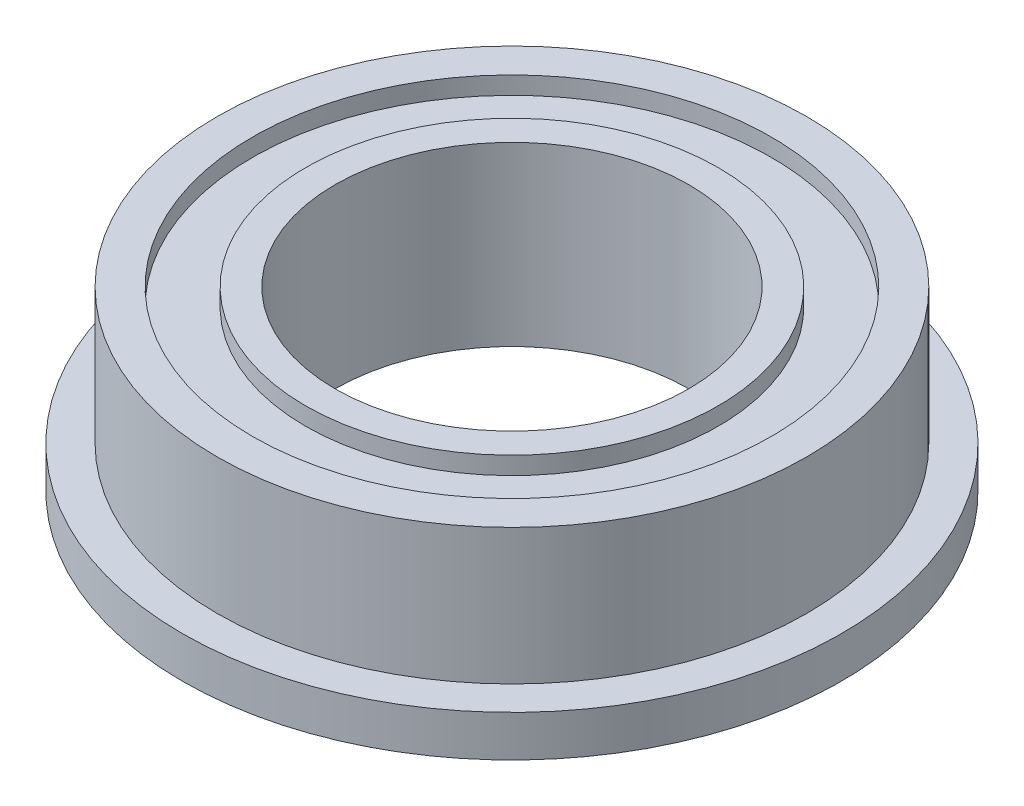
ISO-10303-21;
HEADER;
FILE_DESCRIPTION(('STEP AP214'),'2;1');
FILE_NAME('part.step','',(''),(''),'','','');
FILE_SCHEMA(('AUTOMOTIVE_DESIGN { 1 0 10303 214 1 1 1 1 }'));
ENDSEC;
DATA;
#1=APPLICATION_CONTEXT('core data for automotive mechanical design processes');
#2=APPLICATION_PROTOCOL_DEFINITION('international standard','automotive_design',2000,#1);
#3=PRODUCT_CONTEXT('',#1,'mechanical');
#4=PRODUCT('Part','Part','',(#3));
#5=PRODUCT_RELATED_PRODUCT_CATEGORY('part','',(#4));
#6=PRODUCT_DEFINITION_FORMATION('','',#4);
#7=PRODUCT_DEFINITION_CONTEXT('part definition',#1,'design');
#8=PRODUCT_DEFINITION('design','',#6,#7);
#9=PRODUCT_DEFINITION_SHAPE('','',#8);
#10=(LENGTH_UNIT() NAMED_UNIT(*) SI_UNIT(.MILLI.,.METRE.));
#11=(NAMED_UNIT(*) PLANE_ANGLE_UNIT() SI_UNIT($,.RADIAN.));
#12=(NAMED_UNIT(*) SI_UNIT($,.STERADIAN.) SOLID_ANGLE_UNIT());
#13=UNCERTAINTY_MEASURE_WITH_UNIT(LENGTH_MEASURE(1.E-05),#10,'distance_accuracy_value','');
#14=(GEOMETRIC_REPRESENTATION_CONTEXT(3) GLOBAL_UNCERTAINTY_ASSIGNED_CONTEXT((#13)) GLOBAL_UNIT_ASSIGNED_CONTEXT((#10,
#11,#12)) REPRESENTATION_CONTEXT('',''));
#15=CARTESIAN_POINT('',(0.,0.,0.));
#16=DIRECTION('',(0.,0.,1.));
#17=DIRECTION('',(1.,0.,0.));
#18=AXIS2_PLACEMENT_3D('',#15,#16,#17);
#19=CARTESIAN_POINT('',(0.,0.,0.));
#20=DIRECTION('',(0.,1.,0.));
#21=DIRECTION('',(0.,0.,1.));
#22=AXIS2_PLACEMENT_3D('',#19,#20,#21);
#23=PLANE('',#22);
#24=CARTESIAN_POINT('',(0.,0.,0.));
#25=DIRECTION('',(0.,1.,0.));
#26=DIRECTION('',(0.,0.,1.));
#27=AXIS2_PLACEMENT_3D('',#24,#25,#26);
#28=CIRCLE('',#27,3.);
#29=CARTESIAN_POINT('',(0.,0.,3.));
#30=VERTEX_POINT('',#29);
#31=EDGE_CURVE('E43',#30,#30,#28,.T.);
#32=ORIENTED_EDGE('',*,*,#31,.T.);
#33=EDGE_LOOP('',(#32));
#34=FACE_BOUND('',#33,.T.);
#35=CARTESIAN_POINT('',(0.,0.,0.));
#36=DIRECTION('',(0.,1.,0.));
#37=DIRECTION('',(0.,0.,1.));
#38=AXIS2_PLACEMENT_3D('',#35,#36,#37);
#39=CIRCLE('',#38,3.5);
#40=CARTESIAN_POINT('',(0.,0.,3.5));
#41=VERTEX_POINT('',#40);
#42=EDGE_CURVE('E77',#41,#41,#39,.T.);
#43=ORIENTED_EDGE('',*,*,#42,.F.);
#44=EDGE_LOOP('',(#43));
#45=FACE_BOUND('',#44,.T.);
#46=ADVANCED_FACE('F32',(#34,#45),#23,.F.);
#47=CARTESIAN_POINT('',(0.,3.,0.));
#48=DIRECTION('',(0.,1.,0.));
#49=DIRECTION('',(0.,0.,1.));
#50=AXIS2_PLACEMENT_3D('',#47,#48,#49);
#51=PLANE('',#50);
#52=CARTESIAN_POINT('',(0.,3.,0.));
#53=DIRECTION('',(0.,1.,0.));
#54=DIRECTION('',(0.,0.,1.));
#55=AXIS2_PLACEMENT_3D('',#52,#53,#54);
#56=CIRCLE('',#55,3.);
#57=CARTESIAN_POINT('',(0.,3.,3.));
#58=VERTEX_POINT('',#57);
#59=EDGE_CURVE('E39',#58,#58,#56,.T.);
#60=ORIENTED_EDGE('',*,*,#59,.F.);
#61=EDGE_LOOP('',(#60));
#62=FACE_BOUND('',#61,.T.);
#63=CARTESIAN_POINT('',(0.,3.,0.));
#64=DIRECTION('',(0.,1.,0.));
#65=DIRECTION('',(0.,0.,1.));
#66=AXIS2_PLACEMENT_3D('',#63,#64,#65);
#67=CIRCLE('',#66,3.5);
#68=CARTESIAN_POINT('',(0.,3.,3.5));
#69=VERTEX_POINT('',#68);
#70=EDGE_CURVE('E65',#69,#69,#67,.T.);
#71=ORIENTED_EDGE('',*,*,#70,.T.);
#72=EDGE_LOOP('',(#71));
#73=FACE_BOUND('',#72,.T.);
#74=ADVANCED_FACE('F93',(#62,#73),#51,.T.);
#75=CARTESIAN_POINT('',(0.,3.,0.));
#76=DIRECTION('',(0.,1.,0.));
#77=DIRECTION('',(0.,0.,1.));
#78=AXIS2_PLACEMENT_3D('',#75,#76,#77);
#79=CIRCLE('',#78,4.4);
#80=CARTESIAN_POINT('',(0.,3.,4.4));
#81=VERTEX_POINT('',#80);
#82=EDGE_CURVE('E59',#81,#81,#79,.T.);
#83=ORIENTED_EDGE('',*,*,#82,.F.);
#84=EDGE_LOOP('',(#83));
#85=FACE_BOUND('',#84,.T.);
#86=CARTESIAN_POINT('',(0.,3.,0.));
#87=DIRECTION('',(0.,1.,0.));
#88=DIRECTION('',(0.,0.,1.));
#89=AXIS2_PLACEMENT_3D('',#86,#87,#88);
#90=CIRCLE('',#89,5.);
#91=CARTESIAN_POINT('',(0.,3.,5.));
#92=VERTEX_POINT('',#91);
#93=EDGE_CURVE('E10',#92,#92,#90,.T.);
#94=ORIENTED_EDGE('',*,*,#93,.T.);
#95=EDGE_LOOP('',(#94));
#96=FACE_BOUND('',#95,.T.);
#97=ADVANCED_FACE('F99',(#85,#96),#51,.T.);
#98=CARTESIAN_POINT('',(0.,0.,0.));
#99=DIRECTION('',(0.,1.,0.));
#100=DIRECTION('',(0.,0.,1.));
#101=AXIS2_PLACEMENT_3D('',#98,#99,#100);
#102=CIRCLE('',#101,4.4);
#103=CARTESIAN_POINT('',(0.,0.,4.4));
#104=VERTEX_POINT('',#103);
#105=EDGE_CURVE('E71',#104,#104,#102,.T.);
#106=ORIENTED_EDGE('',*,*,#105,.T.);
#107=EDGE_LOOP('',(#106));
#108=FACE_BOUND('',#107,.T.);
#109=CARTESIAN_POINT('',(0.,0.,0.));
#110=DIRECTION('',(0.,1.,0.));
#111=DIRECTION('',(0.,0.,1.));
#112=AXIS2_PLACEMENT_3D('',#109,#110,#111);
#113=CIRCLE('',#112,5.59);
#114=CARTESIAN_POINT('',(0.,0.,5.59));
#115=VERTEX_POINT('',#114);
#116=EDGE_CURVE('E50',#115,#115,#113,.T.);
#117=ORIENTED_EDGE('',*,*,#116,.F.);
#118=EDGE_LOOP('',(#117));
#119=FACE_BOUND('',#118,.T.);
#120=ADVANCED_FACE('F95',(#108,#119),#23,.F.);
#121=CARTESIAN_POINT('',(0.,3.,0.));
#122=DIRECTION('',(0.,-1.,0.));
#123=DIRECTION('',(0.,0.,-1.));
#124=AXIS2_PLACEMENT_3D('',#121,#122,#123);
#125=CYLINDRICAL_SURFACE('',#124,5.);
#126=CARTESIAN_POINT('',(0.,0.7,0.));
#127=DIRECTION('',(0.,1.,0.));
#128=DIRECTION('',(0.,0.,1.));
#129=AXIS2_PLACEMENT_3D('',#126,#127,#128);
#130=CIRCLE('',#129,5.);
#131=CARTESIAN_POINT('',(0.,0.7,5.));
#132=VERTEX_POINT('',#131);
#133=EDGE_CURVE('E53',#132,#132,#130,.T.);
#134=ORIENTED_EDGE('',*,*,#133,.T.);
#135=EDGE_LOOP('',(#134));
#136=FACE_BOUND('',#135,.T.);
#137=ORIENTED_EDGE('',*,*,#93,.F.);
#138=EDGE_LOOP('',(#137));
#139=FACE_BOUND('',#138,.T.);
#140=ADVANCED_FACE('F34',(#136,#139),#125,.T.);
#141=CARTESIAN_POINT('',(0.,3.,0.));
#142=DIRECTION('',(0.,-1.,0.));
#143=DIRECTION('',(0.,0.,-1.));
#144=AXIS2_PLACEMENT_3D('',#141,#142,#143);
#145=CYLINDRICAL_SURFACE('',#144,3.);
#146=ORIENTED_EDGE('',*,*,#59,.T.);
#147=EDGE_LOOP('',(#146));
#148=FACE_BOUND('',#147,.T.);
#149=ORIENTED_EDGE('',*,*,#31,.F.);
#150=EDGE_LOOP('',(#149));
#151=FACE_BOUND('',#150,.T.);
#152=ADVANCED_FACE('F108',(#148,#151),#145,.F.);
#153=CARTESIAN_POINT('',(0.,0.7,0.));
#154=DIRECTION('',(0.,1.,0.));
#155=DIRECTION('',(0.,0.,1.));
#156=AXIS2_PLACEMENT_3D('',#153,#154,#155);
#157=PLANE('',#156);
#158=CARTESIAN_POINT('',(0.,0.7,0.));
#159=DIRECTION('',(0.,1.,0.));
#160=DIRECTION('',(0.,0.,1.));
#161=AXIS2_PLACEMENT_3D('',#158,#159,#160);
#162=CIRCLE('',#161,5.59);
#163=CARTESIAN_POINT('',(0.,0.7,5.59));
#164=VERTEX_POINT('',#163);
#165=EDGE_CURVE('E48',#164,#164,#162,.T.);
#166=ORIENTED_EDGE('',*,*,#165,.T.);
#167=EDGE_LOOP('',(#166));
#168=FACE_BOUND('',#167,.T.);
#169=ORIENTED_EDGE('',*,*,#133,.F.);
#170=EDGE_LOOP('',(#169));
#171=FACE_BOUND('',#170,.T.);
#172=ADVANCED_FACE('F118',(#168,#171),#157,.T.);
#173=CARTESIAN_POINT('',(0.,0.7,0.));
#174=DIRECTION('',(0.,-1.,0.));
#175=DIRECTION('',(0.,0.,-1.));
#176=AXIS2_PLACEMENT_3D('',#173,#174,#175);
#177=CYLINDRICAL_SURFACE('',#176,5.59);
#178=ORIENTED_EDGE('',*,*,#165,.F.);
#179=EDGE_LOOP('',(#178));
#180=FACE_BOUND('',#179,.T.);
#181=ORIENTED_EDGE('',*,*,#116,.T.);
#182=EDGE_LOOP('',(#181));
#183=FACE_BOUND('',#182,.T.);
#184=ADVANCED_FACE('F115',(#180,#183),#177,.T.);
#185=CARTESIAN_POINT('',(0.,2.7,0.));
#186=DIRECTION('',(0.,1.,0.));
#187=DIRECTION('',(0.,0.,1.));
#188=AXIS2_PLACEMENT_3D('',#185,#186,#187);
#189=CYLINDRICAL_SURFACE('',#188,4.4);
#190=CARTESIAN_POINT('',(0.,2.7,0.));
#191=DIRECTION('',(0.,1.,0.));
#192=DIRECTION('',(0.,0.,1.));
#193=AXIS2_PLACEMENT_3D('',#190,#191,#192);
#194=CIRCLE('',#193,4.4);
#195=CARTESIAN_POINT('',(0.,2.7,4.4));
#196=VERTEX_POINT('',#195);
#197=EDGE_CURVE('E58',#196,#196,#194,.T.);
#198=ORIENTED_EDGE('',*,*,#197,.F.);
#199=EDGE_LOOP('',(#198));
#200=FACE_BOUND('',#199,.T.);
#201=ORIENTED_EDGE('',*,*,#82,.T.);
#202=EDGE_LOOP('',(#201));
#203=FACE_BOUND('',#202,.T.);
#204=ADVANCED_FACE('F117',(#200,#203),#189,.F.);
#205=CARTESIAN_POINT('',(0.,2.7,0.));
#206=DIRECTION('',(0.,1.,0.));
#207=DIRECTION('',(0.,0.,1.));
#208=AXIS2_PLACEMENT_3D('',#205,#206,#207);
#209=PLANE('',#208);
#210=CARTESIAN_POINT('',(0.,2.7,0.));
#211=DIRECTION('',(0.,1.,0.));
#212=DIRECTION('',(0.,0.,1.));
#213=AXIS2_PLACEMENT_3D('',#210,#211,#212);
#214=CIRCLE('',#213,3.5);
#215=CARTESIAN_POINT('',(0.,2.7,3.5));
#216=VERTEX_POINT('',#215);
#217=EDGE_CURVE('E62',#216,#216,#214,.T.);
#218=ORIENTED_EDGE('',*,*,#217,.F.);
#219=EDGE_LOOP('',(#218));
#220=FACE_BOUND('',#219,.T.);
#221=ORIENTED_EDGE('',*,*,#197,.T.);
#222=EDGE_LOOP('',(#221));
#223=FACE_BOUND('',#222,.T.);
#224=ADVANCED_FACE('F125',(#220,#223),#209,.T.);
#225=CARTESIAN_POINT('',(0.,2.7,0.));
#226=DIRECTION('',(0.,1.,0.));
#227=DIRECTION('',(0.,0.,1.));
#228=AXIS2_PLACEMENT_3D('',#225,#226,#227);
#229=CYLINDRICAL_SURFACE('',#228,3.5);
#230=ORIENTED_EDGE('',*,*,#217,.T.);
#231=EDGE_LOOP('',(#230));
#232=FACE_BOUND('',#231,.T.);
#233=ORIENTED_EDGE('',*,*,#70,.F.);
#234=EDGE_LOOP('',(#233));
#235=FACE_BOUND('',#234,.T.);
#236=ADVANCED_FACE('F178',(#232,#235),#229,.T.);
#237=CARTESIAN_POINT('',(0.,0.3,0.));
#238=DIRECTION('',(0.,1.,0.));
#239=DIRECTION('',(0.,0.,1.));
#240=AXIS2_PLACEMENT_3D('',#237,#238,#239);
#241=PLANE('',#240);
#242=CARTESIAN_POINT('',(0.,0.3,0.));
#243=DIRECTION('',(0.,1.,0.));
#244=DIRECTION('',(0.,0.,1.));
#245=AXIS2_PLACEMENT_3D('',#242,#243,#244);
#246=CIRCLE('',#245,4.4);
#247=CARTESIAN_POINT('',(0.,0.3,4.4));
#248=VERTEX_POINT('',#247);
#249=EDGE_CURVE('E68',#248,#248,#246,.T.);
#250=ORIENTED_EDGE('',*,*,#249,.F.);
#251=EDGE_LOOP('',(#250));
#252=FACE_BOUND('',#251,.T.);
#253=CARTESIAN_POINT('',(0.,0.3,0.));
#254=DIRECTION('',(0.,1.,0.));
#255=DIRECTION('',(0.,0.,1.));
#256=AXIS2_PLACEMENT_3D('',#253,#254,#255);
#257=CIRCLE('',#256,3.5);
#258=CARTESIAN_POINT('',(0.,0.3,3.5));
#259=VERTEX_POINT('',#258);
#260=EDGE_CURVE('E74',#259,#259,#257,.T.);
#261=ORIENTED_EDGE('',*,*,#260,.T.);
#262=EDGE_LOOP('',(#261));
#263=FACE_BOUND('',#262,.T.);
#264=ADVANCED_FACE('F83',(#252,#263),#241,.F.);
#265=CARTESIAN_POINT('',(0.,0.3,0.));
#266=DIRECTION('',(0.,-1.,0.));
#267=DIRECTION('',(0.,0.,-1.));
#268=AXIS2_PLACEMENT_3D('',#265,#266,#267);
#269=CYLINDRICAL_SURFACE('',#268,4.4);
#270=ORIENTED_EDGE('',*,*,#249,.T.);
#271=EDGE_LOOP('',(#270));
#272=FACE_BOUND('',#271,.T.);
#273=ORIENTED_EDGE('',*,*,#105,.F.);
#274=EDGE_LOOP('',(#273));
#275=FACE_BOUND('',#274,.T.);
#276=ADVANCED_FACE('F88',(#272,#275),#269,.F.);
#277=CARTESIAN_POINT('',(0.,0.3,0.));
#278=DIRECTION('',(0.,-1.,0.));
#279=DIRECTION('',(0.,0.,-1.));
#280=AXIS2_PLACEMENT_3D('',#277,#278,#279);
#281=CYLINDRICAL_SURFACE('',#280,3.5);
#282=ORIENTED_EDGE('',*,*,#260,.F.);
#283=EDGE_LOOP('',(#282));
#284=FACE_BOUND('',#283,.T.);
#285=ORIENTED_EDGE('',*,*,#42,.T.);
#286=EDGE_LOOP('',(#285));
#287=FACE_BOUND('',#286,.T.);
#288=ADVANCED_FACE('F85',(#284,#287),#281,.T.);
#289=CLOSED_SHELL('',(#46,#74,#97,#120,#140,#152,#172,#184,#204,#224,#236,#264,#276,#288));
#290=MANIFOLD_SOLID_BREP('B2',#289);
#291=ADVANCED_BREP_SHAPE_REPRESENTATION('',(#18,#290),#14);
#292=SHAPE_DEFINITION_REPRESENTATION(#9,#291);
ENDSEC;
END-ISO-10303-21;
